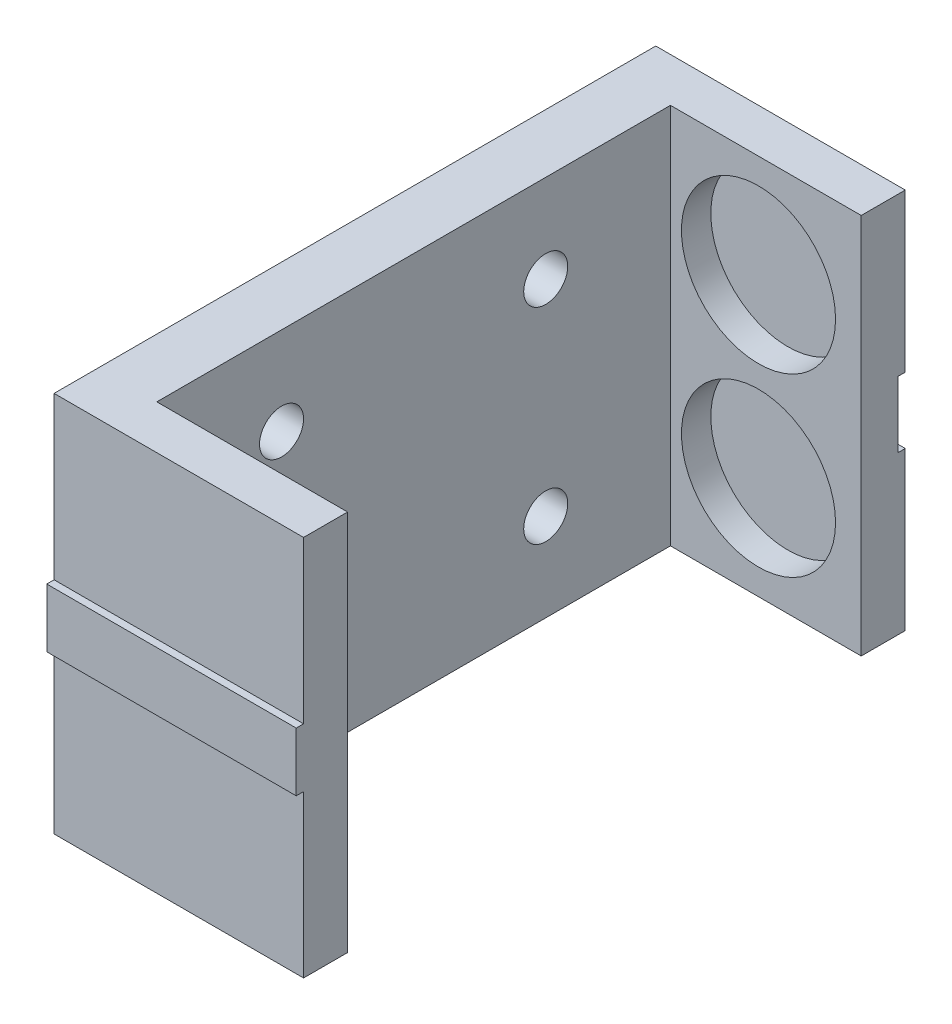
ISO-10303-21;
HEADER;
FILE_DESCRIPTION(('STEP AP214'),'2;1');
FILE_NAME('part.step','',(''),(''),'','','');
FILE_SCHEMA(('AUTOMOTIVE_DESIGN { 1 0 10303 214 1 1 1 1 }'));
ENDSEC;
DATA;
#1=APPLICATION_CONTEXT('core data for automotive mechanical design processes');
#2=APPLICATION_PROTOCOL_DEFINITION('international standard','automotive_design',2000,#1);
#3=PRODUCT_CONTEXT('',#1,'mechanical');
#4=PRODUCT('Part','Part','',(#3));
#5=PRODUCT_RELATED_PRODUCT_CATEGORY('part','',(#4));
#6=PRODUCT_DEFINITION_FORMATION('','',#4);
#7=PRODUCT_DEFINITION_CONTEXT('part definition',#1,'design');
#8=PRODUCT_DEFINITION('design','',#6,#7);
#9=PRODUCT_DEFINITION_SHAPE('','',#8);
#10=(LENGTH_UNIT() NAMED_UNIT(*) SI_UNIT(.MILLI.,.METRE.));
#11=(NAMED_UNIT(*) PLANE_ANGLE_UNIT() SI_UNIT($,.RADIAN.));
#12=(NAMED_UNIT(*) SI_UNIT($,.STERADIAN.) SOLID_ANGLE_UNIT());
#13=UNCERTAINTY_MEASURE_WITH_UNIT(LENGTH_MEASURE(1.E-05),#10,'distance_accuracy_value','');
#14=(GEOMETRIC_REPRESENTATION_CONTEXT(3) GLOBAL_UNCERTAINTY_ASSIGNED_CONTEXT((#13)) GLOBAL_UNIT_ASSIGNED_CONTEXT((#10,
#11,#12)) REPRESENTATION_CONTEXT('',''));
#15=CARTESIAN_POINT('',(0.,0.,0.));
#16=DIRECTION('',(0.,0.,1.));
#17=DIRECTION('',(1.,0.,0.));
#18=AXIS2_PLACEMENT_3D('',#15,#16,#17);
#19=CARTESIAN_POINT('',(0.,0.,-38.));
#20=DIRECTION('',(0.,0.,1.));
#21=DIRECTION('',(1.,0.,0.));
#22=AXIS2_PLACEMENT_3D('',#19,#20,#21);
#23=PLANE('',#22);
#24=DIRECTION('',(0.,1.,0.));
#25=VECTOR('',#24,1.);
#26=CARTESIAN_POINT('',(17.,0.,-38.));
#27=LINE('',#26,#25);
#28=CARTESIAN_POINT('',(17.,15.25,-38.));
#29=VERTEX_POINT('',#28);
#30=CARTESIAN_POINT('',(17.,26.,-38.));
#31=VERTEX_POINT('',#30);
#32=EDGE_CURVE('E304',#29,#31,#27,.T.);
#33=ORIENTED_EDGE('',*,*,#32,.F.);
#34=DIRECTION('',(1.,0.,0.));
#35=VECTOR('',#34,1.);
#36=CARTESIAN_POINT('',(17.,15.25,-38.));
#37=LINE('',#36,#35);
#38=CARTESIAN_POINT('',(0.,15.25,-38.));
#39=VERTEX_POINT('',#38);
#40=EDGE_CURVE('E162',#39,#29,#37,.T.);
#41=ORIENTED_EDGE('',*,*,#40,.F.);
#42=DIRECTION('',(0.,1.,0.));
#43=VECTOR('',#42,1.);
#44=CARTESIAN_POINT('',(0.,26.,-38.));
#45=LINE('',#44,#43);
#46=CARTESIAN_POINT('',(0.,26.,-38.));
#47=VERTEX_POINT('',#46);
#48=EDGE_CURVE('E259',#39,#47,#45,.T.);
#49=ORIENTED_EDGE('',*,*,#48,.T.);
#50=DIRECTION('',(1.,0.,0.));
#51=VECTOR('',#50,1.);
#52=CARTESIAN_POINT('',(0.,26.,-38.));
#53=LINE('',#52,#51);
#54=EDGE_CURVE('E267',#47,#31,#53,.T.);
#55=ORIENTED_EDGE('',*,*,#54,.T.);
#56=EDGE_LOOP('',(#33,#41,#49,#55));
#57=FACE_BOUND('',#56,.T.);
#58=ADVANCED_FACE('F33',(#57),#23,.F.);
#59=CARTESIAN_POINT('',(0.,0.,3.));
#60=DIRECTION('',(0.,0.,-1.));
#61=DIRECTION('',(-1.,0.,0.));
#62=AXIS2_PLACEMENT_3D('',#59,#60,#61);
#63=PLANE('',#62);
#64=DIRECTION('',(-1.,0.,0.));
#65=VECTOR('',#64,1.);
#66=CARTESIAN_POINT('',(0.,15.,3.));
#67=LINE('',#66,#65);
#68=CARTESIAN_POINT('',(17.,15.,3.));
#69=VERTEX_POINT('',#68);
#70=CARTESIAN_POINT('',(0.,15.,3.));
#71=VERTEX_POINT('',#70);
#72=EDGE_CURVE('E58',#69,#71,#67,.T.);
#73=ORIENTED_EDGE('',*,*,#72,.F.);
#74=DIRECTION('',(0.,1.,0.));
#75=VECTOR('',#74,1.);
#76=CARTESIAN_POINT('',(17.,0.,3.));
#77=LINE('',#76,#75);
#78=CARTESIAN_POINT('',(17.,26.,3.));
#79=VERTEX_POINT('',#78);
#80=EDGE_CURVE('E195',#69,#79,#77,.T.);
#81=ORIENTED_EDGE('',*,*,#80,.T.);
#82=DIRECTION('',(-1.,0.,0.));
#83=VECTOR('',#82,1.);
#84=CARTESIAN_POINT('',(0.,26.,3.));
#85=LINE('',#84,#83);
#86=CARTESIAN_POINT('',(0.,26.,3.));
#87=VERTEX_POINT('',#86);
#88=EDGE_CURVE('E229',#79,#87,#85,.T.);
#89=ORIENTED_EDGE('',*,*,#88,.T.);
#90=DIRECTION('',(0.,-1.,0.));
#91=VECTOR('',#90,1.);
#92=CARTESIAN_POINT('',(0.,0.,3.));
#93=LINE('',#92,#91);
#94=EDGE_CURVE('E230',#87,#71,#93,.T.);
#95=ORIENTED_EDGE('',*,*,#94,.T.);
#96=EDGE_LOOP('',(#73,#81,#89,#95));
#97=FACE_BOUND('',#96,.T.);
#98=ADVANCED_FACE('F400',(#97),#63,.F.);
#99=DIRECTION('',(1.,0.,0.));
#100=VECTOR('',#99,1.);
#101=CARTESIAN_POINT('',(0.,11.,3.));
#102=LINE('',#101,#100);
#103=CARTESIAN_POINT('',(0.,11.,3.));
#104=VERTEX_POINT('',#103);
#105=CARTESIAN_POINT('',(17.,11.,3.));
#106=VERTEX_POINT('',#105);
#107=EDGE_CURVE('E190',#104,#106,#102,.T.);
#108=ORIENTED_EDGE('',*,*,#107,.F.);
#109=CARTESIAN_POINT('',(0.,0.,3.));
#110=VERTEX_POINT('',#109);
#111=EDGE_CURVE('E235',#104,#110,#93,.T.);
#112=ORIENTED_EDGE('',*,*,#111,.T.);
#113=DIRECTION('',(1.,0.,0.));
#114=VECTOR('',#113,1.);
#115=CARTESIAN_POINT('',(0.,0.,3.));
#116=LINE('',#115,#114);
#117=CARTESIAN_POINT('',(17.,0.,3.));
#118=VERTEX_POINT('',#117);
#119=EDGE_CURVE('E228',#110,#118,#116,.T.);
#120=ORIENTED_EDGE('',*,*,#119,.T.);
#121=EDGE_CURVE('E227',#118,#106,#77,.T.);
#122=ORIENTED_EDGE('',*,*,#121,.T.);
#123=EDGE_LOOP('',(#108,#112,#120,#122));
#124=FACE_BOUND('',#123,.T.);
#125=ADVANCED_FACE('F402',(#124),#63,.F.);
#126=CARTESIAN_POINT('',(4.,26.,-38.));
#127=DIRECTION('',(-1.,0.,0.));
#128=DIRECTION('',(0.,-1.,0.));
#129=AXIS2_PLACEMENT_3D('',#126,#127,#128);
#130=PLANE('',#129);
#131=CARTESIAN_POINT('',(4.,20.,-8.5));
#132=DIRECTION('',(-1.,0.,0.));
#133=DIRECTION('',(0.,0.,1.));
#134=AXIS2_PLACEMENT_3D('',#131,#132,#133);
#135=CIRCLE('',#134,1.5);
#136=CARTESIAN_POINT('',(4.,20.,-7.));
#137=VERTEX_POINT('',#136);
#138=EDGE_CURVE('E260',#137,#137,#135,.T.);
#139=ORIENTED_EDGE('',*,*,#138,.T.);
#140=EDGE_LOOP('',(#139));
#141=FACE_BOUND('',#140,.T.);
#142=CARTESIAN_POINT('',(4.,6.,-8.5));
#143=DIRECTION('',(-1.,0.,0.));
#144=DIRECTION('',(0.,0.,1.));
#145=AXIS2_PLACEMENT_3D('',#142,#143,#144);
#146=CIRCLE('',#145,1.5);
#147=CARTESIAN_POINT('',(4.,6.,-7.));
#148=VERTEX_POINT('',#147);
#149=EDGE_CURVE('E276',#148,#148,#146,.T.);
#150=ORIENTED_EDGE('',*,*,#149,.T.);
#151=EDGE_LOOP('',(#150));
#152=FACE_BOUND('',#151,.T.);
#153=CARTESIAN_POINT('',(4.,19.999545391507,-26.5));
#154=DIRECTION('',(-1.,0.,0.));
#155=DIRECTION('',(0.,0.,1.));
#156=AXIS2_PLACEMENT_3D('',#153,#154,#155);
#157=CIRCLE('',#156,1.5);
#158=CARTESIAN_POINT('',(4.,19.999545391507,-25.));
#159=VERTEX_POINT('',#158);
#160=EDGE_CURVE('E282',#159,#159,#157,.T.);
#161=ORIENTED_EDGE('',*,*,#160,.T.);
#162=EDGE_LOOP('',(#161));
#163=FACE_BOUND('',#162,.T.);
#164=CARTESIAN_POINT('',(4.,6.,-26.5));
#165=DIRECTION('',(-1.,0.,0.));
#166=DIRECTION('',(0.,0.,1.));
#167=AXIS2_PLACEMENT_3D('',#164,#165,#166);
#168=CIRCLE('',#167,1.5);
#169=CARTESIAN_POINT('',(4.,6.,-25.));
#170=VERTEX_POINT('',#169);
#171=EDGE_CURVE('E288',#170,#170,#168,.T.);
#172=ORIENTED_EDGE('',*,*,#171,.T.);
#173=EDGE_LOOP('',(#172));
#174=FACE_BOUND('',#173,.T.);
#175=DIRECTION('',(0.,-1.,0.));
#176=VECTOR('',#175,1.);
#177=CARTESIAN_POINT('',(4.,0.,-35.));
#178=LINE('',#177,#176);
#179=CARTESIAN_POINT('',(4.,26.,-35.));
#180=VERTEX_POINT('',#179);
#181=CARTESIAN_POINT('',(4.,0.,-35.));
#182=VERTEX_POINT('',#181);
#183=EDGE_CURVE('E302',#180,#182,#178,.T.);
#184=ORIENTED_EDGE('',*,*,#183,.F.);
#185=DIRECTION('',(0.,0.,1.));
#186=VECTOR('',#185,1.);
#187=CARTESIAN_POINT('',(4.,26.,-38.));
#188=LINE('',#187,#186);
#189=CARTESIAN_POINT('',(4.,26.,0.));
#190=VERTEX_POINT('',#189);
#191=EDGE_CURVE('E247',#180,#190,#188,.T.);
#192=ORIENTED_EDGE('',*,*,#191,.T.);
#193=DIRECTION('',(0.,-1.,0.));
#194=VECTOR('',#193,1.);
#195=CARTESIAN_POINT('',(4.,26.,0.));
#196=LINE('',#195,#194);
#197=CARTESIAN_POINT('',(4.,0.,0.));
#198=VERTEX_POINT('',#197);
#199=EDGE_CURVE('E256',#190,#198,#196,.T.);
#200=ORIENTED_EDGE('',*,*,#199,.T.);
#201=DIRECTION('',(0.,0.,1.));
#202=VECTOR('',#201,1.);
#203=CARTESIAN_POINT('',(4.,0.,-38.));
#204=LINE('',#203,#202);
#205=EDGE_CURVE('E251',#182,#198,#204,.T.);
#206=ORIENTED_EDGE('',*,*,#205,.F.);
#207=EDGE_LOOP('',(#184,#192,#200,#206));
#208=FACE_BOUND('',#207,.T.);
#209=ADVANCED_FACE('F361',(#141,#152,#163,#174,#208),#130,.F.);
#210=CARTESIAN_POINT('',(0.,0.,3.));
#211=DIRECTION('',(1.,0.,0.));
#212=DIRECTION('',(0.,0.,-1.));
#213=AXIS2_PLACEMENT_3D('',#210,#211,#212);
#214=PLANE('',#213);
#215=ORIENTED_EDGE('',*,*,#48,.F.);
#216=DIRECTION('',(0.,0.,-1.));
#217=VECTOR('',#216,1.);
#218=CARTESIAN_POINT('',(0.,15.25,-37.5));
#219=LINE('',#218,#217);
#220=CARTESIAN_POINT('',(0.,15.25,-37.5));
#221=VERTEX_POINT('',#220);
#222=EDGE_CURVE('E170',#221,#39,#219,.T.);
#223=ORIENTED_EDGE('',*,*,#222,.F.);
#224=DIRECTION('',(0.,1.,0.));
#225=VECTOR('',#224,1.);
#226=CARTESIAN_POINT('',(0.,15.25,-37.5));
#227=LINE('',#226,#225);
#228=CARTESIAN_POINT('',(0.,10.75,-37.5));
#229=VERTEX_POINT('',#228);
#230=EDGE_CURVE('E155',#229,#221,#227,.T.);
#231=ORIENTED_EDGE('',*,*,#230,.F.);
#232=DIRECTION('',(0.,0.,-1.));
#233=VECTOR('',#232,1.);
#234=CARTESIAN_POINT('',(0.,10.75,-37.5));
#235=LINE('',#234,#233);
#236=CARTESIAN_POINT('',(0.,10.75,-38.));
#237=VERTEX_POINT('',#236);
#238=EDGE_CURVE('E153',#229,#237,#235,.T.);
#239=ORIENTED_EDGE('',*,*,#238,.T.);
#240=CARTESIAN_POINT('',(0.,0.,-38.));
#241=VERTEX_POINT('',#240);
#242=EDGE_CURVE('E270',#241,#237,#45,.T.);
#243=ORIENTED_EDGE('',*,*,#242,.F.);
#244=DIRECTION('',(0.,0.,-1.));
#245=VECTOR('',#244,1.);
#246=CARTESIAN_POINT('',(0.,0.,3.));
#247=LINE('',#246,#245);
#248=EDGE_CURVE('E11',#110,#241,#247,.T.);
#249=ORIENTED_EDGE('',*,*,#248,.F.);
#250=ORIENTED_EDGE('',*,*,#111,.F.);
#251=DIRECTION('',(0.,0.,-1.));
#252=VECTOR('',#251,1.);
#253=CARTESIAN_POINT('',(0.,11.,3.5));
#254=LINE('',#253,#252);
#255=CARTESIAN_POINT('',(0.,11.,3.5));
#256=VERTEX_POINT('',#255);
#257=EDGE_CURVE('E201',#256,#104,#254,.T.);
#258=ORIENTED_EDGE('',*,*,#257,.F.);
#259=DIRECTION('',(0.,-1.,0.));
#260=VECTOR('',#259,1.);
#261=CARTESIAN_POINT('',(0.,11.,3.5));
#262=LINE('',#261,#260);
#263=CARTESIAN_POINT('',(0.,15.,3.5));
#264=VERTEX_POINT('',#263);
#265=EDGE_CURVE('E175',#264,#256,#262,.T.);
#266=ORIENTED_EDGE('',*,*,#265,.F.);
#267=DIRECTION('',(0.,0.,-1.));
#268=VECTOR('',#267,1.);
#269=CARTESIAN_POINT('',(0.,15.,3.5));
#270=LINE('',#269,#268);
#271=EDGE_CURVE('E184',#264,#71,#270,.T.);
#272=ORIENTED_EDGE('',*,*,#271,.T.);
#273=ORIENTED_EDGE('',*,*,#94,.F.);
#274=DIRECTION('',(0.,0.,-1.));
#275=VECTOR('',#274,1.);
#276=CARTESIAN_POINT('',(0.,26.,3.));
#277=LINE('',#276,#275);
#278=EDGE_CURVE('E376',#87,#47,#277,.T.);
#279=ORIENTED_EDGE('',*,*,#278,.T.);
#280=EDGE_LOOP('',(#215,#223,#231,#239,#243,#249,#250,#258,#266,#272,#273,#279));
#281=FACE_BOUND('',#280,.T.);
#282=CARTESIAN_POINT('',(0.,6.,-26.5));
#283=DIRECTION('',(-1.,0.,0.));
#284=DIRECTION('',(0.,0.,1.));
#285=AXIS2_PLACEMENT_3D('',#282,#283,#284);
#286=CIRCLE('',#285,1.5);
#287=CARTESIAN_POINT('',(0.,6.,-25.));
#288=VERTEX_POINT('',#287);
#289=EDGE_CURVE('E291',#288,#288,#286,.T.);
#290=ORIENTED_EDGE('',*,*,#289,.F.);
#291=EDGE_LOOP('',(#290));
#292=FACE_BOUND('',#291,.T.);
#293=CARTESIAN_POINT('',(0.,19.999545391507,-26.5));
#294=DIRECTION('',(-1.,0.,0.));
#295=DIRECTION('',(0.,0.,1.));
#296=AXIS2_PLACEMENT_3D('',#293,#294,#295);
#297=CIRCLE('',#296,1.5);
#298=CARTESIAN_POINT('',(0.,19.999545391507,-25.));
#299=VERTEX_POINT('',#298);
#300=EDGE_CURVE('E285',#299,#299,#297,.T.);
#301=ORIENTED_EDGE('',*,*,#300,.F.);
#302=EDGE_LOOP('',(#301));
#303=FACE_BOUND('',#302,.T.);
#304=CARTESIAN_POINT('',(0.,6.,-8.5));
#305=DIRECTION('',(-1.,0.,0.));
#306=DIRECTION('',(0.,0.,1.));
#307=AXIS2_PLACEMENT_3D('',#304,#305,#306);
#308=CIRCLE('',#307,1.5);
#309=CARTESIAN_POINT('',(0.,6.,-7.));
#310=VERTEX_POINT('',#309);
#311=EDGE_CURVE('E279',#310,#310,#308,.T.);
#312=ORIENTED_EDGE('',*,*,#311,.F.);
#313=EDGE_LOOP('',(#312));
#314=FACE_BOUND('',#313,.T.);
#315=CARTESIAN_POINT('',(0.,20.,-8.5));
#316=DIRECTION('',(-1.,0.,0.));
#317=DIRECTION('',(0.,0.,1.));
#318=AXIS2_PLACEMENT_3D('',#315,#316,#317);
#319=CIRCLE('',#318,1.5);
#320=CARTESIAN_POINT('',(0.,20.,-7.));
#321=VERTEX_POINT('',#320);
#322=EDGE_CURVE('E273',#321,#321,#319,.T.);
#323=ORIENTED_EDGE('',*,*,#322,.F.);
#324=EDGE_LOOP('',(#323));
#325=FACE_BOUND('',#324,.T.);
#326=ADVANCED_FACE('F35',(#281,#292,#303,#314,#325),#214,.F.);
#327=CARTESIAN_POINT('',(0.,0.,3.));
#328=DIRECTION('',(0.,1.,0.));
#329=DIRECTION('',(0.,0.,1.));
#330=AXIS2_PLACEMENT_3D('',#327,#328,#329);
#331=PLANE('',#330);
#332=ORIENTED_EDGE('',*,*,#248,.T.);
#333=DIRECTION('',(-1.,0.,0.));
#334=VECTOR('',#333,1.);
#335=CARTESIAN_POINT('',(0.,0.,-38.));
#336=LINE('',#335,#334);
#337=CARTESIAN_POINT('',(17.,0.,-38.));
#338=VERTEX_POINT('',#337);
#339=EDGE_CURVE('E264',#338,#241,#336,.T.);
#340=ORIENTED_EDGE('',*,*,#339,.F.);
#341=DIRECTION('',(0.,0.,-1.));
#342=VECTOR('',#341,1.);
#343=CARTESIAN_POINT('',(17.,0.,-38.));
#344=LINE('',#343,#342);
#345=CARTESIAN_POINT('',(17.,0.,-35.));
#346=VERTEX_POINT('',#345);
#347=EDGE_CURVE('E301',#346,#338,#344,.T.);
#348=ORIENTED_EDGE('',*,*,#347,.F.);
#349=DIRECTION('',(-1.,0.,0.));
#350=VECTOR('',#349,1.);
#351=CARTESIAN_POINT('',(17.,0.,-35.));
#352=LINE('',#351,#350);
#353=EDGE_CURVE('E298',#346,#182,#352,.T.);
#354=ORIENTED_EDGE('',*,*,#353,.T.);
#355=ORIENTED_EDGE('',*,*,#205,.T.);
#356=DIRECTION('',(1.,0.,0.));
#357=VECTOR('',#356,1.);
#358=CARTESIAN_POINT('',(0.,0.,0.));
#359=LINE('',#358,#357);
#360=CARTESIAN_POINT('',(17.,0.,0.));
#361=VERTEX_POINT('',#360);
#362=EDGE_CURVE('E250',#198,#361,#359,.T.);
#363=ORIENTED_EDGE('',*,*,#362,.T.);
#364=DIRECTION('',(0.,0.,-1.));
#365=VECTOR('',#364,1.);
#366=CARTESIAN_POINT('',(17.,0.,3.));
#367=LINE('',#366,#365);
#368=EDGE_CURVE('E42',#118,#361,#367,.T.);
#369=ORIENTED_EDGE('',*,*,#368,.F.);
#370=ORIENTED_EDGE('',*,*,#119,.F.);
#371=EDGE_LOOP('',(#332,#340,#348,#354,#355,#363,#369,#370));
#372=FACE_BOUND('',#371,.T.);
#373=ADVANCED_FACE('F359',(#372),#331,.F.);
#374=CARTESIAN_POINT('',(17.,0.,3.));
#375=DIRECTION('',(-1.,0.,0.));
#376=DIRECTION('',(0.,0.,1.));
#377=AXIS2_PLACEMENT_3D('',#374,#375,#376);
#378=PLANE('',#377);
#379=DIRECTION('',(0.,1.,0.));
#380=VECTOR('',#379,1.);
#381=CARTESIAN_POINT('',(17.,0.,0.));
#382=LINE('',#381,#380);
#383=CARTESIAN_POINT('',(17.,26.,0.));
#384=VERTEX_POINT('',#383);
#385=EDGE_CURVE('E370',#361,#384,#382,.T.);
#386=ORIENTED_EDGE('',*,*,#385,.T.);
#387=DIRECTION('',(0.,0.,-1.));
#388=VECTOR('',#387,1.);
#389=CARTESIAN_POINT('',(17.,26.,3.));
#390=LINE('',#389,#388);
#391=EDGE_CURVE('E225',#79,#384,#390,.T.);
#392=ORIENTED_EDGE('',*,*,#391,.F.);
#393=ORIENTED_EDGE('',*,*,#80,.F.);
#394=DIRECTION('',(0.,0.,-1.));
#395=VECTOR('',#394,1.);
#396=CARTESIAN_POINT('',(17.,15.,3.5));
#397=LINE('',#396,#395);
#398=CARTESIAN_POINT('',(17.,15.,3.5));
#399=VERTEX_POINT('',#398);
#400=EDGE_CURVE('E202',#399,#69,#397,.T.);
#401=ORIENTED_EDGE('',*,*,#400,.F.);
#402=DIRECTION('',(0.,1.,0.));
#403=VECTOR('',#402,1.);
#404=CARTESIAN_POINT('',(17.,11.,3.5));
#405=LINE('',#404,#403);
#406=CARTESIAN_POINT('',(17.,11.,3.5));
#407=VERTEX_POINT('',#406);
#408=EDGE_CURVE('E180',#407,#399,#405,.T.);
#409=ORIENTED_EDGE('',*,*,#408,.F.);
#410=DIRECTION('',(0.,0.,-1.));
#411=VECTOR('',#410,1.);
#412=CARTESIAN_POINT('',(17.,11.,3.5));
#413=LINE('',#412,#411);
#414=EDGE_CURVE('E198',#407,#106,#413,.T.);
#415=ORIENTED_EDGE('',*,*,#414,.T.);
#416=ORIENTED_EDGE('',*,*,#121,.F.);
#417=ORIENTED_EDGE('',*,*,#368,.T.);
#418=EDGE_LOOP('',(#386,#392,#393,#401,#409,#415,#416,#417));
#419=FACE_BOUND('',#418,.T.);
#420=ADVANCED_FACE('F222',(#419),#378,.F.);
#421=CARTESIAN_POINT('',(0.,26.,3.));
#422=DIRECTION('',(0.,-1.,0.));
#423=DIRECTION('',(0.,0.,-1.));
#424=AXIS2_PLACEMENT_3D('',#421,#422,#423);
#425=PLANE('',#424);
#426=DIRECTION('',(-1.,0.,0.));
#427=VECTOR('',#426,1.);
#428=CARTESIAN_POINT('',(0.,26.,0.));
#429=LINE('',#428,#427);
#430=EDGE_CURVE('E245',#384,#190,#429,.T.);
#431=ORIENTED_EDGE('',*,*,#430,.T.);
#432=ORIENTED_EDGE('',*,*,#191,.F.);
#433=DIRECTION('',(-1.,0.,0.));
#434=VECTOR('',#433,1.);
#435=CARTESIAN_POINT('',(17.,26.,-35.));
#436=LINE('',#435,#434);
#437=CARTESIAN_POINT('',(17.,26.,-35.));
#438=VERTEX_POINT('',#437);
#439=EDGE_CURVE('E294',#438,#180,#436,.T.);
#440=ORIENTED_EDGE('',*,*,#439,.F.);
#441=DIRECTION('',(0.,0.,1.));
#442=VECTOR('',#441,1.);
#443=CARTESIAN_POINT('',(17.,26.,-38.));
#444=LINE('',#443,#442);
#445=EDGE_CURVE('E309',#31,#438,#444,.T.);
#446=ORIENTED_EDGE('',*,*,#445,.F.);
#447=ORIENTED_EDGE('',*,*,#54,.F.);
#448=ORIENTED_EDGE('',*,*,#278,.F.);
#449=ORIENTED_EDGE('',*,*,#88,.F.);
#450=ORIENTED_EDGE('',*,*,#391,.T.);
#451=EDGE_LOOP('',(#431,#432,#440,#446,#447,#448,#449,#450));
#452=FACE_BOUND('',#451,.T.);
#453=ADVANCED_FACE('F369',(#452),#425,.F.);
#454=CARTESIAN_POINT('',(0.,0.,0.));
#455=DIRECTION('',(0.,0.,-1.));
#456=DIRECTION('',(-1.,0.,0.));
#457=AXIS2_PLACEMENT_3D('',#454,#455,#456);
#458=PLANE('',#457);
#459=CARTESIAN_POINT('',(10.,19.,0.));
#460=DIRECTION('',(0.,0.,-1.));
#461=DIRECTION('',(-1.,0.,0.));
#462=AXIS2_PLACEMENT_3D('',#459,#460,#461);
#463=CIRCLE('',#462,5.25);
#464=CARTESIAN_POINT('',(4.75,19.,0.));
#465=VERTEX_POINT('',#464);
#466=EDGE_CURVE('E318',#465,#465,#463,.T.);
#467=ORIENTED_EDGE('',*,*,#466,.F.);
#468=EDGE_LOOP('',(#467));
#469=FACE_BOUND('',#468,.T.);
#470=CARTESIAN_POINT('',(10.,7.,0.));
#471=DIRECTION('',(0.,0.,-1.));
#472=DIRECTION('',(-1.,0.,0.));
#473=AXIS2_PLACEMENT_3D('',#470,#471,#472);
#474=CIRCLE('',#473,5.25);
#475=CARTESIAN_POINT('',(4.75,7.,0.));
#476=VERTEX_POINT('',#475);
#477=EDGE_CURVE('E312',#476,#476,#474,.T.);
#478=ORIENTED_EDGE('',*,*,#477,.F.);
#479=EDGE_LOOP('',(#478));
#480=FACE_BOUND('',#479,.T.);
#481=ORIENTED_EDGE('',*,*,#199,.F.);
#482=ORIENTED_EDGE('',*,*,#430,.F.);
#483=ORIENTED_EDGE('',*,*,#385,.F.);
#484=ORIENTED_EDGE('',*,*,#362,.F.);
#485=EDGE_LOOP('',(#481,#482,#483,#484));
#486=FACE_BOUND('',#485,.T.);
#487=ADVANCED_FACE('F366',(#469,#480,#486),#458,.T.);
#488=ORIENTED_EDGE('',*,*,#242,.T.);
#489=DIRECTION('',(-1.,0.,0.));
#490=VECTOR('',#489,1.);
#491=CARTESIAN_POINT('',(17.,10.75,-38.));
#492=LINE('',#491,#490);
#493=CARTESIAN_POINT('',(17.,10.75,-38.));
#494=VERTEX_POINT('',#493);
#495=EDGE_CURVE('E390',#494,#237,#492,.T.);
#496=ORIENTED_EDGE('',*,*,#495,.F.);
#497=EDGE_CURVE('E168',#338,#494,#27,.T.);
#498=ORIENTED_EDGE('',*,*,#497,.F.);
#499=ORIENTED_EDGE('',*,*,#339,.T.);
#500=EDGE_LOOP('',(#488,#496,#498,#499));
#501=FACE_BOUND('',#500,.T.);
#502=ADVANCED_FACE('F389',(#501),#23,.F.);
#503=CARTESIAN_POINT('',(4.,20.,-8.5));
#504=DIRECTION('',(-1.,0.,0.));
#505=DIRECTION('',(0.,0.,1.));
#506=AXIS2_PLACEMENT_3D('',#503,#504,#505);
#507=CYLINDRICAL_SURFACE('',#506,1.5);
#508=ORIENTED_EDGE('',*,*,#138,.F.);
#509=EDGE_LOOP('',(#508));
#510=FACE_BOUND('',#509,.T.);
#511=ORIENTED_EDGE('',*,*,#322,.T.);
#512=EDGE_LOOP('',(#511));
#513=FACE_BOUND('',#512,.T.);
#514=ADVANCED_FACE('F447',(#510,#513),#507,.F.);
#515=CARTESIAN_POINT('',(4.,6.,-8.5));
#516=DIRECTION('',(-1.,0.,0.));
#517=DIRECTION('',(0.,0.,1.));
#518=AXIS2_PLACEMENT_3D('',#515,#516,#517);
#519=CYLINDRICAL_SURFACE('',#518,1.5);
#520=ORIENTED_EDGE('',*,*,#149,.F.);
#521=EDGE_LOOP('',(#520));
#522=FACE_BOUND('',#521,.T.);
#523=ORIENTED_EDGE('',*,*,#311,.T.);
#524=EDGE_LOOP('',(#523));
#525=FACE_BOUND('',#524,.T.);
#526=ADVANCED_FACE('F449',(#522,#525),#519,.F.);
#527=CARTESIAN_POINT('',(4.,19.999545391507,-26.5));
#528=DIRECTION('',(-1.,0.,0.));
#529=DIRECTION('',(0.,0.,1.));
#530=AXIS2_PLACEMENT_3D('',#527,#528,#529);
#531=CYLINDRICAL_SURFACE('',#530,1.5);
#532=ORIENTED_EDGE('',*,*,#160,.F.);
#533=EDGE_LOOP('',(#532));
#534=FACE_BOUND('',#533,.T.);
#535=ORIENTED_EDGE('',*,*,#300,.T.);
#536=EDGE_LOOP('',(#535));
#537=FACE_BOUND('',#536,.T.);
#538=ADVANCED_FACE('F437',(#534,#537),#531,.F.);
#539=CARTESIAN_POINT('',(4.,6.,-26.5));
#540=DIRECTION('',(-1.,0.,0.));
#541=DIRECTION('',(0.,0.,1.));
#542=AXIS2_PLACEMENT_3D('',#539,#540,#541);
#543=CYLINDRICAL_SURFACE('',#542,1.5);
#544=ORIENTED_EDGE('',*,*,#171,.F.);
#545=EDGE_LOOP('',(#544));
#546=FACE_BOUND('',#545,.T.);
#547=ORIENTED_EDGE('',*,*,#289,.T.);
#548=EDGE_LOOP('',(#547));
#549=FACE_BOUND('',#548,.T.);
#550=ADVANCED_FACE('F346',(#546,#549),#543,.F.);
#551=CARTESIAN_POINT('',(17.,0.,-35.));
#552=DIRECTION('',(0.,0.,-1.));
#553=DIRECTION('',(-1.,0.,0.));
#554=AXIS2_PLACEMENT_3D('',#551,#552,#553);
#555=PLANE('',#554);
#556=CARTESIAN_POINT('',(10.,7.,-35.));
#557=DIRECTION('',(0.,0.,1.));
#558=DIRECTION('',(1.,0.,0.));
#559=AXIS2_PLACEMENT_3D('',#556,#557,#558);
#560=CIRCLE('',#559,5.25);
#561=CARTESIAN_POINT('',(15.25,7.,-35.));
#562=VERTEX_POINT('',#561);
#563=EDGE_CURVE('E207',#562,#562,#560,.T.);
#564=ORIENTED_EDGE('',*,*,#563,.F.);
#565=EDGE_LOOP('',(#564));
#566=FACE_BOUND('',#565,.T.);
#567=CARTESIAN_POINT('',(10.,19.,-35.));
#568=DIRECTION('',(0.,0.,1.));
#569=DIRECTION('',(1.,0.,0.));
#570=AXIS2_PLACEMENT_3D('',#567,#568,#569);
#571=CIRCLE('',#570,5.25);
#572=CARTESIAN_POINT('',(15.25,19.,-35.));
#573=VERTEX_POINT('',#572);
#574=EDGE_CURVE('E324',#573,#573,#571,.T.);
#575=ORIENTED_EDGE('',*,*,#574,.F.);
#576=EDGE_LOOP('',(#575));
#577=FACE_BOUND('',#576,.T.);
#578=ORIENTED_EDGE('',*,*,#183,.T.);
#579=ORIENTED_EDGE('',*,*,#353,.F.);
#580=DIRECTION('',(0.,-1.,0.));
#581=VECTOR('',#580,1.);
#582=CARTESIAN_POINT('',(17.,0.,-35.));
#583=LINE('',#582,#581);
#584=EDGE_CURVE('E307',#438,#346,#583,.T.);
#585=ORIENTED_EDGE('',*,*,#584,.F.);
#586=ORIENTED_EDGE('',*,*,#439,.T.);
#587=EDGE_LOOP('',(#578,#579,#585,#586));
#588=FACE_BOUND('',#587,.T.);
#589=ADVANCED_FACE('F343',(#566,#577,#588),#555,.F.);
#590=CARTESIAN_POINT('',(17.,0.,0.));
#591=DIRECTION('',(1.,0.,0.));
#592=DIRECTION('',(0.,1.,0.));
#593=AXIS2_PLACEMENT_3D('',#590,#591,#592);
#594=PLANE('',#593);
#595=DIRECTION('',(0.,0.,-1.));
#596=VECTOR('',#595,1.);
#597=CARTESIAN_POINT('',(17.,15.25,-37.5));
#598=LINE('',#597,#596);
#599=CARTESIAN_POINT('',(17.,15.25,-37.5));
#600=VERTEX_POINT('',#599);
#601=EDGE_CURVE('E194',#600,#29,#598,.T.);
#602=ORIENTED_EDGE('',*,*,#601,.T.);
#603=ORIENTED_EDGE('',*,*,#32,.T.);
#604=ORIENTED_EDGE('',*,*,#445,.T.);
#605=ORIENTED_EDGE('',*,*,#584,.T.);
#606=ORIENTED_EDGE('',*,*,#347,.T.);
#607=ORIENTED_EDGE('',*,*,#497,.T.);
#608=DIRECTION('',(0.,0.,-1.));
#609=VECTOR('',#608,1.);
#610=CARTESIAN_POINT('',(17.,10.75,-37.5));
#611=LINE('',#610,#609);
#612=CARTESIAN_POINT('',(17.,10.75,-37.5));
#613=VERTEX_POINT('',#612);
#614=EDGE_CURVE('E150',#613,#494,#611,.T.);
#615=ORIENTED_EDGE('',*,*,#614,.F.);
#616=DIRECTION('',(0.,-1.,0.));
#617=VECTOR('',#616,1.);
#618=CARTESIAN_POINT('',(17.,15.25,-37.5));
#619=LINE('',#618,#617);
#620=EDGE_CURVE('E156',#600,#613,#619,.T.);
#621=ORIENTED_EDGE('',*,*,#620,.F.);
#622=EDGE_LOOP('',(#602,#603,#604,#605,#606,#607,#615,#621));
#623=FACE_BOUND('',#622,.T.);
#624=ADVANCED_FACE('F165',(#623),#594,.T.);
#625=CARTESIAN_POINT('',(10.,7.,2.));
#626=DIRECTION('',(0.,0.,-1.));
#627=DIRECTION('',(-1.,0.,0.));
#628=AXIS2_PLACEMENT_3D('',#625,#626,#627);
#629=CYLINDRICAL_SURFACE('',#628,5.25);
#630=CARTESIAN_POINT('',(10.,7.,2.));
#631=DIRECTION('',(0.,0.,-1.));
#632=DIRECTION('',(-1.,0.,0.));
#633=AXIS2_PLACEMENT_3D('',#630,#631,#632);
#634=CIRCLE('',#633,5.25);
#635=CARTESIAN_POINT('',(4.75,7.,2.));
#636=VERTEX_POINT('',#635);
#637=EDGE_CURVE('E305',#636,#636,#634,.T.);
#638=ORIENTED_EDGE('',*,*,#637,.F.);
#639=EDGE_LOOP('',(#638));
#640=FACE_BOUND('',#639,.T.);
#641=ORIENTED_EDGE('',*,*,#477,.T.);
#642=EDGE_LOOP('',(#641));
#643=FACE_BOUND('',#642,.T.);
#644=ADVANCED_FACE('F464',(#640,#643),#629,.F.);
#645=CARTESIAN_POINT('',(10.,7.,2.));
#646=DIRECTION('',(0.,0.,-1.));
#647=DIRECTION('',(-1.,0.,0.));
#648=AXIS2_PLACEMENT_3D('',#645,#646,#647);
#649=PLANE('',#648);
#650=ORIENTED_EDGE('',*,*,#637,.T.);
#651=EDGE_LOOP('',(#650));
#652=FACE_BOUND('',#651,.T.);
#653=ADVANCED_FACE('F467',(#652),#649,.T.);
#654=CARTESIAN_POINT('',(10.,19.,2.));
#655=DIRECTION('',(0.,0.,-1.));
#656=DIRECTION('',(-1.,0.,0.));
#657=AXIS2_PLACEMENT_3D('',#654,#655,#656);
#658=CYLINDRICAL_SURFACE('',#657,5.25);
#659=CARTESIAN_POINT('',(10.,19.,2.));
#660=DIRECTION('',(0.,0.,-1.));
#661=DIRECTION('',(-1.,0.,0.));
#662=AXIS2_PLACEMENT_3D('',#659,#660,#661);
#663=CIRCLE('',#662,5.25);
#664=CARTESIAN_POINT('',(4.75,19.,2.));
#665=VERTEX_POINT('',#664);
#666=EDGE_CURVE('E315',#665,#665,#663,.T.);
#667=ORIENTED_EDGE('',*,*,#666,.F.);
#668=EDGE_LOOP('',(#667));
#669=FACE_BOUND('',#668,.T.);
#670=ORIENTED_EDGE('',*,*,#466,.T.);
#671=EDGE_LOOP('',(#670));
#672=FACE_BOUND('',#671,.T.);
#673=ADVANCED_FACE('F471',(#669,#672),#658,.F.);
#674=CARTESIAN_POINT('',(10.,19.,2.));
#675=DIRECTION('',(0.,0.,-1.));
#676=DIRECTION('',(-1.,0.,0.));
#677=AXIS2_PLACEMENT_3D('',#674,#675,#676);
#678=PLANE('',#677);
#679=ORIENTED_EDGE('',*,*,#666,.T.);
#680=EDGE_LOOP('',(#679));
#681=FACE_BOUND('',#680,.T.);
#682=ADVANCED_FACE('F475',(#681),#678,.T.);
#683=CARTESIAN_POINT('',(10.,19.,-37.));
#684=DIRECTION('',(0.,0.,1.));
#685=DIRECTION('',(1.,0.,0.));
#686=AXIS2_PLACEMENT_3D('',#683,#684,#685);
#687=CYLINDRICAL_SURFACE('',#686,5.25);
#688=CARTESIAN_POINT('',(10.,19.,-37.));
#689=DIRECTION('',(0.,0.,1.));
#690=DIRECTION('',(1.,0.,0.));
#691=AXIS2_PLACEMENT_3D('',#688,#689,#690);
#692=CIRCLE('',#691,5.25);
#693=CARTESIAN_POINT('',(15.25,19.,-37.));
#694=VERTEX_POINT('',#693);
#695=EDGE_CURVE('E321',#694,#694,#692,.T.);
#696=ORIENTED_EDGE('',*,*,#695,.F.);
#697=EDGE_LOOP('',(#696));
#698=FACE_BOUND('',#697,.T.);
#699=ORIENTED_EDGE('',*,*,#574,.T.);
#700=EDGE_LOOP('',(#699));
#701=FACE_BOUND('',#700,.T.);
#702=ADVANCED_FACE('F479',(#698,#701),#687,.F.);
#703=CARTESIAN_POINT('',(10.,19.,-37.));
#704=DIRECTION('',(0.,0.,1.));
#705=DIRECTION('',(1.,0.,0.));
#706=AXIS2_PLACEMENT_3D('',#703,#704,#705);
#707=PLANE('',#706);
#708=ORIENTED_EDGE('',*,*,#695,.T.);
#709=EDGE_LOOP('',(#708));
#710=FACE_BOUND('',#709,.T.);
#711=ADVANCED_FACE('F339',(#710),#707,.T.);
#712=CARTESIAN_POINT('',(10.,7.,-37.));
#713=DIRECTION('',(0.,0.,1.));
#714=DIRECTION('',(1.,0.,0.));
#715=AXIS2_PLACEMENT_3D('',#712,#713,#714);
#716=CYLINDRICAL_SURFACE('',#715,5.25);
#717=CARTESIAN_POINT('',(10.,7.,-37.));
#718=DIRECTION('',(0.,0.,1.));
#719=DIRECTION('',(1.,0.,0.));
#720=AXIS2_PLACEMENT_3D('',#717,#718,#719);
#721=CIRCLE('',#720,5.25);
#722=CARTESIAN_POINT('',(15.25,7.,-37.));
#723=VERTEX_POINT('',#722);
#724=EDGE_CURVE('E327',#723,#723,#721,.T.);
#725=ORIENTED_EDGE('',*,*,#724,.F.);
#726=EDGE_LOOP('',(#725));
#727=FACE_BOUND('',#726,.T.);
#728=ORIENTED_EDGE('',*,*,#563,.T.);
#729=EDGE_LOOP('',(#728));
#730=FACE_BOUND('',#729,.T.);
#731=ADVANCED_FACE('F336',(#727,#730),#716,.F.);
#732=CARTESIAN_POINT('',(10.,7.,-37.));
#733=DIRECTION('',(0.,0.,1.));
#734=DIRECTION('',(1.,0.,0.));
#735=AXIS2_PLACEMENT_3D('',#732,#733,#734);
#736=PLANE('',#735);
#737=ORIENTED_EDGE('',*,*,#724,.T.);
#738=EDGE_LOOP('',(#737));
#739=FACE_BOUND('',#738,.T.);
#740=ADVANCED_FACE('F334',(#739),#736,.T.);
#741=CARTESIAN_POINT('',(0.,11.,3.5));
#742=DIRECTION('',(0.,1.,0.));
#743=DIRECTION('',(0.,0.,1.));
#744=AXIS2_PLACEMENT_3D('',#741,#742,#743);
#745=PLANE('',#744);
#746=ORIENTED_EDGE('',*,*,#107,.T.);
#747=ORIENTED_EDGE('',*,*,#414,.F.);
#748=DIRECTION('',(1.,0.,0.));
#749=VECTOR('',#748,1.);
#750=CARTESIAN_POINT('',(0.,11.,3.5));
#751=LINE('',#750,#749);
#752=EDGE_CURVE('E178',#256,#407,#751,.T.);
#753=ORIENTED_EDGE('',*,*,#752,.F.);
#754=ORIENTED_EDGE('',*,*,#257,.T.);
#755=EDGE_LOOP('',(#746,#747,#753,#754));
#756=FACE_BOUND('',#755,.T.);
#757=ADVANCED_FACE('F489',(#756),#745,.F.);
#758=CARTESIAN_POINT('',(0.,15.,3.5));
#759=DIRECTION('',(0.,-1.,0.));
#760=DIRECTION('',(0.,0.,-1.));
#761=AXIS2_PLACEMENT_3D('',#758,#759,#760);
#762=PLANE('',#761);
#763=ORIENTED_EDGE('',*,*,#72,.T.);
#764=ORIENTED_EDGE('',*,*,#271,.F.);
#765=DIRECTION('',(-1.,0.,0.));
#766=VECTOR('',#765,1.);
#767=CARTESIAN_POINT('',(0.,15.,3.5));
#768=LINE('',#767,#766);
#769=EDGE_CURVE('E182',#399,#264,#768,.T.);
#770=ORIENTED_EDGE('',*,*,#769,.F.);
#771=ORIENTED_EDGE('',*,*,#400,.T.);
#772=EDGE_LOOP('',(#763,#764,#770,#771));
#773=FACE_BOUND('',#772,.T.);
#774=ADVANCED_FACE('F218',(#773),#762,.F.);
#775=CARTESIAN_POINT('',(0.,0.,3.5));
#776=DIRECTION('',(0.,0.,-1.));
#777=DIRECTION('',(-1.,0.,0.));
#778=AXIS2_PLACEMENT_3D('',#775,#776,#777);
#779=PLANE('',#778);
#780=ORIENTED_EDGE('',*,*,#265,.T.);
#781=ORIENTED_EDGE('',*,*,#752,.T.);
#782=ORIENTED_EDGE('',*,*,#408,.T.);
#783=ORIENTED_EDGE('',*,*,#769,.T.);
#784=EDGE_LOOP('',(#780,#781,#782,#783));
#785=FACE_BOUND('',#784,.T.);
#786=ADVANCED_FACE('F495',(#785),#779,.F.);
#787=CARTESIAN_POINT('',(17.,15.25,-37.5));
#788=DIRECTION('',(0.,1.,0.));
#789=DIRECTION('',(0.,0.,1.));
#790=AXIS2_PLACEMENT_3D('',#787,#788,#789);
#791=PLANE('',#790);
#792=ORIENTED_EDGE('',*,*,#40,.T.);
#793=ORIENTED_EDGE('',*,*,#601,.F.);
#794=DIRECTION('',(1.,0.,0.));
#795=VECTOR('',#794,1.);
#796=CARTESIAN_POINT('',(17.,15.25,-37.5));
#797=LINE('',#796,#795);
#798=EDGE_CURVE('E50',#221,#600,#797,.T.);
#799=ORIENTED_EDGE('',*,*,#798,.F.);
#800=ORIENTED_EDGE('',*,*,#222,.T.);
#801=EDGE_LOOP('',(#792,#793,#799,#800));
#802=FACE_BOUND('',#801,.T.);
#803=ADVANCED_FACE('F498',(#802),#791,.F.);
#804=CARTESIAN_POINT('',(17.,10.75,-37.5));
#805=DIRECTION('',(0.,-1.,0.));
#806=DIRECTION('',(0.,0.,-1.));
#807=AXIS2_PLACEMENT_3D('',#804,#805,#806);
#808=PLANE('',#807);
#809=ORIENTED_EDGE('',*,*,#495,.T.);
#810=ORIENTED_EDGE('',*,*,#238,.F.);
#811=DIRECTION('',(-1.,0.,0.));
#812=VECTOR('',#811,1.);
#813=CARTESIAN_POINT('',(17.,10.75,-37.5));
#814=LINE('',#813,#812);
#815=EDGE_CURVE('E147',#613,#229,#814,.T.);
#816=ORIENTED_EDGE('',*,*,#815,.F.);
#817=ORIENTED_EDGE('',*,*,#614,.T.);
#818=EDGE_LOOP('',(#809,#810,#816,#817));
#819=FACE_BOUND('',#818,.T.);
#820=ADVANCED_FACE('F148',(#819),#808,.F.);
#821=CARTESIAN_POINT('',(0.,0.,-37.5));
#822=DIRECTION('',(0.,0.,-1.));
#823=DIRECTION('',(-1.,0.,0.));
#824=AXIS2_PLACEMENT_3D('',#821,#822,#823);
#825=PLANE('',#824);
#826=ORIENTED_EDGE('',*,*,#620,.T.);
#827=ORIENTED_EDGE('',*,*,#815,.T.);
#828=ORIENTED_EDGE('',*,*,#230,.T.);
#829=ORIENTED_EDGE('',*,*,#798,.T.);
#830=EDGE_LOOP('',(#826,#827,#828,#829));
#831=FACE_BOUND('',#830,.T.);
#832=ADVANCED_FACE('F159',(#831),#825,.T.);
#833=CLOSED_SHELL('',(#58,#98,#125,#209,#326,#373,#420,#453,#487,#502,#514,#526,#538,#550,#589,
#624,#644,#653,#673,#682,#702,#711,#731,#740,#757,#774,#786,#803,#820,#832));
#834=MANIFOLD_SOLID_BREP('B2',#833);
#835=ADVANCED_BREP_SHAPE_REPRESENTATION('',(#18,#834),#14);
#836=SHAPE_DEFINITION_REPRESENTATION(#9,#835);
ENDSEC;
END-ISO-10303-21;
